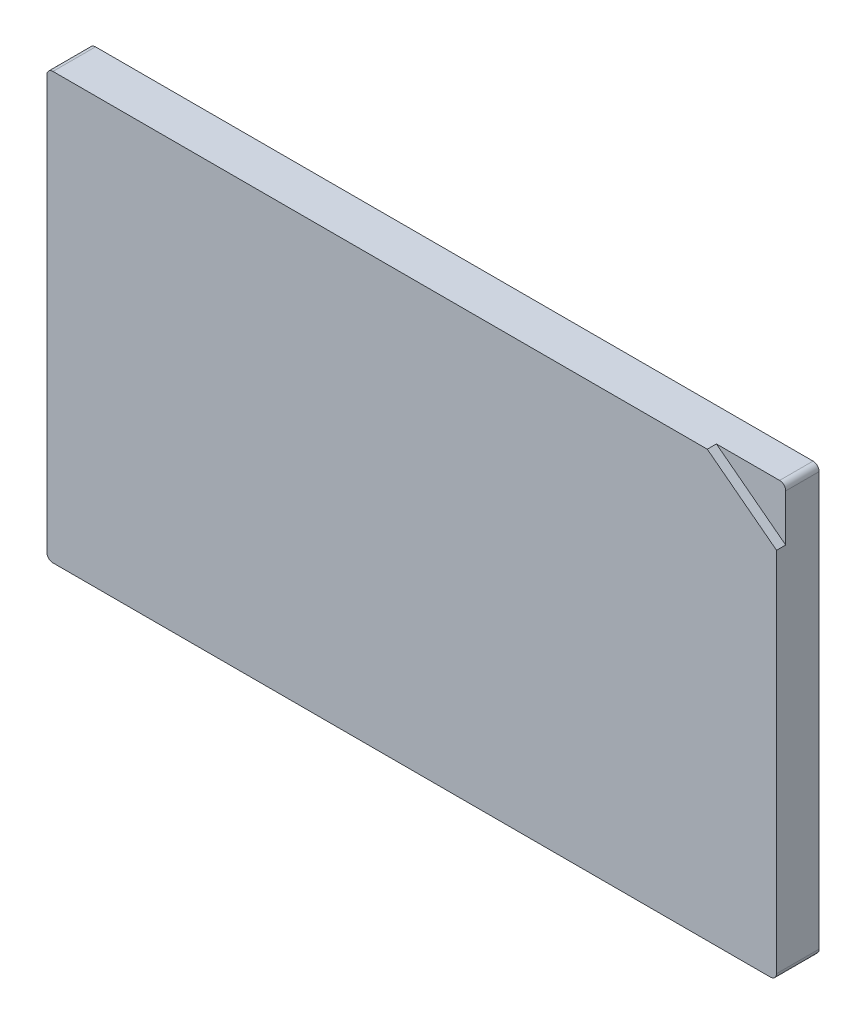
ISO-10303-21;
HEADER;
FILE_DESCRIPTION(('STEP AP214'),'2;1');
FILE_NAME('part.step','',(''),(''),'','','');
FILE_SCHEMA(('AUTOMOTIVE_DESIGN { 1 0 10303 214 1 1 1 1 }'));
ENDSEC;
DATA;
#1=APPLICATION_CONTEXT('core data for automotive mechanical design processes');
#2=APPLICATION_PROTOCOL_DEFINITION('international standard','automotive_design',2000,#1);
#3=PRODUCT_CONTEXT('',#1,'mechanical');
#4=PRODUCT('Part','Part','',(#3));
#5=PRODUCT_RELATED_PRODUCT_CATEGORY('part','',(#4));
#6=PRODUCT_DEFINITION_FORMATION('','',#4);
#7=PRODUCT_DEFINITION_CONTEXT('part definition',#1,'design');
#8=PRODUCT_DEFINITION('design','',#6,#7);
#9=PRODUCT_DEFINITION_SHAPE('','',#8);
#10=(LENGTH_UNIT() NAMED_UNIT(*) SI_UNIT(.MILLI.,.METRE.));
#11=(NAMED_UNIT(*) PLANE_ANGLE_UNIT() SI_UNIT($,.RADIAN.));
#12=(NAMED_UNIT(*) SI_UNIT($,.STERADIAN.) SOLID_ANGLE_UNIT());
#13=UNCERTAINTY_MEASURE_WITH_UNIT(LENGTH_MEASURE(1.E-05),#10,'distance_accuracy_value','');
#14=(GEOMETRIC_REPRESENTATION_CONTEXT(3) GLOBAL_UNCERTAINTY_ASSIGNED_CONTEXT((#13)) GLOBAL_UNIT_ASSIGNED_CONTEXT((#10,
#11,#12)) REPRESENTATION_CONTEXT('',''));
#15=CARTESIAN_POINT('',(0.,0.,0.));
#16=DIRECTION('',(0.,0.,1.));
#17=DIRECTION('',(1.,0.,0.));
#18=AXIS2_PLACEMENT_3D('',#15,#16,#17);
#19=CARTESIAN_POINT('',(-7.51456310679612,4.9126213592233,0.7));
#20=DIRECTION('',(1.,0.,0.));
#21=DIRECTION('',(0.,0.,-1.));
#22=AXIS2_PLACEMENT_3D('',#19,#20,#21);
#23=PLANE('',#22);
#24=DIRECTION('',(0.,-1.,0.));
#25=VECTOR('',#24,1.);
#26=CARTESIAN_POINT('',(-7.51456310679612,4.9126213592233,0.7));
#27=LINE('',#26,#25);
#28=CARTESIAN_POINT('',(-7.51456310679612,4.8126213592233,0.7));
#29=VERTEX_POINT('',#28);
#30=CARTESIAN_POINT('',(-7.51456310679612,-1.9873786407767,0.7));
#31=VERTEX_POINT('',#30);
#32=EDGE_CURVE('E144',#29,#31,#27,.T.);
#33=ORIENTED_EDGE('',*,*,#32,.F.);
#34=DIRECTION('',(0.,0.,-1.));
#35=VECTOR('',#34,1.);
#36=CARTESIAN_POINT('',(-7.51456310679612,4.8126213592233,0.7));
#37=LINE('',#36,#35);
#38=CARTESIAN_POINT('',(-7.51456310679612,4.8126213592233,0.));
#39=VERTEX_POINT('',#38);
#40=EDGE_CURVE('E163',#29,#39,#37,.T.);
#41=ORIENTED_EDGE('',*,*,#40,.T.);
#42=DIRECTION('',(0.,-1.,0.));
#43=VECTOR('',#42,1.);
#44=CARTESIAN_POINT('',(-7.51456310679612,4.9126213592233,0.));
#45=LINE('',#44,#43);
#46=CARTESIAN_POINT('',(-7.51456310679612,-1.9873786407767,0.));
#47=VERTEX_POINT('',#46);
#48=EDGE_CURVE('E139',#39,#47,#45,.T.);
#49=ORIENTED_EDGE('',*,*,#48,.T.);
#50=DIRECTION('',(0.,0.,-1.));
#51=VECTOR('',#50,1.);
#52=CARTESIAN_POINT('',(-7.51456310679612,-1.9873786407767,0.7));
#53=LINE('',#52,#51);
#54=EDGE_CURVE('E153',#47,#31,#53,.F.);
#55=ORIENTED_EDGE('',*,*,#54,.T.);
#56=EDGE_LOOP('',(#33,#41,#49,#55));
#57=FACE_BOUND('',#56,.T.);
#58=ADVANCED_FACE('F34',(#57),#23,.F.);
#59=CARTESIAN_POINT('',(-7.51456310679612,-2.0873786407767,0.7));
#60=DIRECTION('',(0.,1.,0.));
#61=DIRECTION('',(0.,0.,1.));
#62=AXIS2_PLACEMENT_3D('',#59,#60,#61);
#63=PLANE('',#62);
#64=DIRECTION('',(1.,0.,0.));
#65=VECTOR('',#64,1.);
#66=CARTESIAN_POINT('',(-7.51456310679612,-2.0873786407767,0.7));
#67=LINE('',#66,#65);
#68=CARTESIAN_POINT('',(-7.41456310679612,-2.0873786407767,0.7));
#69=VERTEX_POINT('',#68);
#70=CARTESIAN_POINT('',(4.38543689320388,-2.0873786407767,0.7));
#71=VERTEX_POINT('',#70);
#72=EDGE_CURVE('E147',#69,#71,#67,.T.);
#73=ORIENTED_EDGE('',*,*,#72,.F.);
#74=DIRECTION('',(0.,0.,-1.));
#75=VECTOR('',#74,1.);
#76=CARTESIAN_POINT('',(-7.41456310679612,-2.0873786407767,0.7));
#77=LINE('',#76,#75);
#78=CARTESIAN_POINT('',(-7.41456310679612,-2.0873786407767,0.));
#79=VERTEX_POINT('',#78);
#80=EDGE_CURVE('E185',#69,#79,#77,.T.);
#81=ORIENTED_EDGE('',*,*,#80,.T.);
#82=DIRECTION('',(1.,0.,0.));
#83=VECTOR('',#82,1.);
#84=CARTESIAN_POINT('',(-7.51456310679612,-2.0873786407767,0.));
#85=LINE('',#84,#83);
#86=CARTESIAN_POINT('',(4.38543689320388,-2.0873786407767,0.));
#87=VERTEX_POINT('',#86);
#88=EDGE_CURVE('E156',#79,#87,#85,.T.);
#89=ORIENTED_EDGE('',*,*,#88,.T.);
#90=DIRECTION('',(0.,0.,-1.));
#91=VECTOR('',#90,1.);
#92=CARTESIAN_POINT('',(4.38543689320388,-2.0873786407767,0.7));
#93=LINE('',#92,#91);
#94=EDGE_CURVE('E183',#87,#71,#93,.F.);
#95=ORIENTED_EDGE('',*,*,#94,.T.);
#96=EDGE_LOOP('',(#73,#81,#89,#95));
#97=FACE_BOUND('',#96,.T.);
#98=ADVANCED_FACE('F214',(#97),#63,.F.);
#99=CARTESIAN_POINT('',(4.48543689320388,4.9126213592233,0.7));
#100=DIRECTION('',(-1.,0.,0.));
#101=DIRECTION('',(0.,-1.,0.));
#102=AXIS2_PLACEMENT_3D('',#99,#100,#101);
#103=PLANE('',#102);
#104=DIRECTION('',(0.,1.,0.));
#105=VECTOR('',#104,1.);
#106=CARTESIAN_POINT('',(4.48543689320388,4.9126213592233,0.7));
#107=LINE('',#106,#105);
#108=CARTESIAN_POINT('',(4.48543689320388,-1.9873786407767,0.7));
#109=VERTEX_POINT('',#108);
#110=CARTESIAN_POINT('',(4.48543689320388,4.0423598927584,0.7));
#111=VERTEX_POINT('',#110);
#112=EDGE_CURVE('E150',#109,#111,#107,.T.);
#113=ORIENTED_EDGE('',*,*,#112,.F.);
#114=DIRECTION('',(0.,0.,-1.));
#115=VECTOR('',#114,1.);
#116=CARTESIAN_POINT('',(4.48543689320388,-1.9873786407767,0.7));
#117=LINE('',#116,#115);
#118=CARTESIAN_POINT('',(4.48543689320388,-1.9873786407767,0.));
#119=VERTEX_POINT('',#118);
#120=EDGE_CURVE('E42',#109,#119,#117,.T.);
#121=ORIENTED_EDGE('',*,*,#120,.T.);
#122=DIRECTION('',(0.,1.,0.));
#123=VECTOR('',#122,1.);
#124=CARTESIAN_POINT('',(4.48543689320388,4.9126213592233,0.));
#125=LINE('',#124,#123);
#126=CARTESIAN_POINT('',(4.48543689320388,4.8126213592233,0.));
#127=VERTEX_POINT('',#126);
#128=EDGE_CURVE('E159',#119,#127,#125,.T.);
#129=ORIENTED_EDGE('',*,*,#128,.T.);
#130=DIRECTION('',(0.,0.,-1.));
#131=VECTOR('',#130,1.);
#132=CARTESIAN_POINT('',(4.48543689320388,4.8126213592233,0.7));
#133=LINE('',#132,#131);
#134=CARTESIAN_POINT('',(4.48543689320388,4.8126213592233,0.55));
#135=VERTEX_POINT('',#134);
#136=EDGE_CURVE('E49',#127,#135,#133,.F.);
#137=ORIENTED_EDGE('',*,*,#136,.T.);
#138=DIRECTION('',(0.,1.,0.));
#139=VECTOR('',#138,1.);
#140=CARTESIAN_POINT('',(4.48543689320388,4.0423598927584,0.55));
#141=LINE('',#140,#139);
#142=CARTESIAN_POINT('',(4.48543689320388,4.0423598927584,0.55));
#143=VERTEX_POINT('',#142);
#144=EDGE_CURVE('E131',#143,#135,#141,.T.);
#145=ORIENTED_EDGE('',*,*,#144,.F.);
#146=DIRECTION('',(0.,0.,1.));
#147=VECTOR('',#146,1.);
#148=CARTESIAN_POINT('',(4.48543689320388,4.0423598927584,0.55));
#149=LINE('',#148,#147);
#150=EDGE_CURVE('E130',#143,#111,#149,.T.);
#151=ORIENTED_EDGE('',*,*,#150,.T.);
#152=EDGE_LOOP('',(#113,#121,#129,#137,#145,#151));
#153=FACE_BOUND('',#152,.T.);
#154=ADVANCED_FACE('F191',(#153),#103,.F.);
#155=CARTESIAN_POINT('',(-7.51456310679612,4.9126213592233,0.7));
#156=DIRECTION('',(0.,-1.,0.));
#157=DIRECTION('',(0.,0.,-1.));
#158=AXIS2_PLACEMENT_3D('',#155,#156,#157);
#159=PLANE('',#158);
#160=DIRECTION('',(-1.,0.,0.));
#161=VECTOR('',#160,1.);
#162=CARTESIAN_POINT('',(-7.51456310679612,4.9126213592233,0.));
#163=LINE('',#162,#161);
#164=CARTESIAN_POINT('',(4.38543689320388,4.9126213592233,0.));
#165=VERTEX_POINT('',#164);
#166=CARTESIAN_POINT('',(-7.41456310679612,4.9126213592233,0.));
#167=VERTEX_POINT('',#166);
#168=EDGE_CURVE('E148',#165,#167,#163,.T.);
#169=ORIENTED_EDGE('',*,*,#168,.T.);
#170=DIRECTION('',(0.,0.,-1.));
#171=VECTOR('',#170,1.);
#172=CARTESIAN_POINT('',(-7.41456310679612,4.9126213592233,0.7));
#173=LINE('',#172,#171);
#174=CARTESIAN_POINT('',(-7.41456310679612,4.9126213592233,0.7));
#175=VERTEX_POINT('',#174);
#176=EDGE_CURVE('E176',#167,#175,#173,.F.);
#177=ORIENTED_EDGE('',*,*,#176,.T.);
#178=DIRECTION('',(-1.,0.,0.));
#179=VECTOR('',#178,1.);
#180=CARTESIAN_POINT('',(-7.51456310679612,4.9126213592233,0.7));
#181=LINE('',#180,#179);
#182=CARTESIAN_POINT('',(3.34607568700057,4.9126213592233,0.7));
#183=VERTEX_POINT('',#182);
#184=EDGE_CURVE('E137',#183,#175,#181,.T.);
#185=ORIENTED_EDGE('',*,*,#184,.F.);
#186=DIRECTION('',(0.,0.,1.));
#187=VECTOR('',#186,1.);
#188=CARTESIAN_POINT('',(3.34607568700057,4.9126213592233,0.55));
#189=LINE('',#188,#187);
#190=CARTESIAN_POINT('',(3.34607568700057,4.9126213592233,0.55));
#191=VERTEX_POINT('',#190);
#192=EDGE_CURVE('E127',#191,#183,#189,.T.);
#193=ORIENTED_EDGE('',*,*,#192,.F.);
#194=DIRECTION('',(-1.,0.,0.));
#195=VECTOR('',#194,1.);
#196=CARTESIAN_POINT('',(4.48543689320388,4.9126213592233,0.55));
#197=LINE('',#196,#195);
#198=CARTESIAN_POINT('',(4.38543689320388,4.9126213592233,0.55));
#199=VERTEX_POINT('',#198);
#200=EDGE_CURVE('E113',#199,#191,#197,.T.);
#201=ORIENTED_EDGE('',*,*,#200,.F.);
#202=DIRECTION('',(0.,0.,-1.));
#203=VECTOR('',#202,1.);
#204=CARTESIAN_POINT('',(4.38543689320388,4.9126213592233,0.7));
#205=LINE('',#204,#203);
#206=EDGE_CURVE('E174',#199,#165,#205,.T.);
#207=ORIENTED_EDGE('',*,*,#206,.T.);
#208=EDGE_LOOP('',(#169,#177,#185,#193,#201,#207));
#209=FACE_BOUND('',#208,.T.);
#210=ADVANCED_FACE('F135',(#209),#159,.F.);
#211=CARTESIAN_POINT('',(0.,0.,0.7));
#212=DIRECTION('',(0.,0.,1.));
#213=DIRECTION('',(1.,0.,0.));
#214=AXIS2_PLACEMENT_3D('',#211,#212,#213);
#215=PLANE('',#214);
#216=ORIENTED_EDGE('',*,*,#184,.T.);
#217=CARTESIAN_POINT('',(-7.41456310679612,4.8126213592233,0.7));
#218=DIRECTION('',(0.,0.,1.));
#219=DIRECTION('',(1.,0.,0.));
#220=AXIS2_PLACEMENT_3D('',#217,#218,#219);
#221=CIRCLE('',#220,0.1);
#222=EDGE_CURVE('E181',#175,#29,#221,.T.);
#223=ORIENTED_EDGE('',*,*,#222,.T.);
#224=ORIENTED_EDGE('',*,*,#32,.T.);
#225=CARTESIAN_POINT('',(-7.41456310679612,-1.9873786407767,0.7));
#226=DIRECTION('',(0.,0.,1.));
#227=DIRECTION('',(1.,0.,0.));
#228=AXIS2_PLACEMENT_3D('',#225,#226,#227);
#229=CIRCLE('',#228,0.1);
#230=EDGE_CURVE('E179',#31,#69,#229,.T.);
#231=ORIENTED_EDGE('',*,*,#230,.T.);
#232=ORIENTED_EDGE('',*,*,#72,.T.);
#233=CARTESIAN_POINT('',(4.38543689320388,-1.9873786407767,0.7));
#234=DIRECTION('',(0.,0.,1.));
#235=DIRECTION('',(1.,0.,0.));
#236=AXIS2_PLACEMENT_3D('',#233,#234,#235);
#237=CIRCLE('',#236,0.1);
#238=EDGE_CURVE('E57',#71,#109,#237,.T.);
#239=ORIENTED_EDGE('',*,*,#238,.T.);
#240=ORIENTED_EDGE('',*,*,#112,.T.);
#241=DIRECTION('',(0.794699236155224,-0.607003397069821,0.));
#242=VECTOR('',#241,1.);
#243=CARTESIAN_POINT('',(3.34607568700057,4.9126213592233,0.7));
#244=LINE('',#243,#242);
#245=EDGE_CURVE('E122',#183,#111,#244,.T.);
#246=ORIENTED_EDGE('',*,*,#245,.F.);
#247=EDGE_LOOP('',(#216,#223,#224,#231,#232,#239,#240,#246));
#248=FACE_BOUND('',#247,.T.);
#249=ADVANCED_FACE('F205',(#248),#215,.T.);
#250=CARTESIAN_POINT('',(0.,0.,0.));
#251=DIRECTION('',(0.,0.,1.));
#252=DIRECTION('',(1.,0.,0.));
#253=AXIS2_PLACEMENT_3D('',#250,#251,#252);
#254=PLANE('',#253);
#255=ORIENTED_EDGE('',*,*,#48,.F.);
#256=CARTESIAN_POINT('',(-7.41456310679612,4.8126213592233,0.));
#257=DIRECTION('',(0.,0.,1.));
#258=DIRECTION('',(1.,0.,0.));
#259=AXIS2_PLACEMENT_3D('',#256,#257,#258);
#260=CIRCLE('',#259,0.1);
#261=EDGE_CURVE('E172',#39,#167,#260,.F.);
#262=ORIENTED_EDGE('',*,*,#261,.T.);
#263=ORIENTED_EDGE('',*,*,#168,.F.);
#264=CARTESIAN_POINT('',(4.38543689320388,4.8126213592233,0.));
#265=DIRECTION('',(0.,0.,1.));
#266=DIRECTION('',(1.,0.,0.));
#267=AXIS2_PLACEMENT_3D('',#264,#265,#266);
#268=CIRCLE('',#267,0.1);
#269=EDGE_CURVE('E166',#165,#127,#268,.F.);
#270=ORIENTED_EDGE('',*,*,#269,.T.);
#271=ORIENTED_EDGE('',*,*,#128,.F.);
#272=CARTESIAN_POINT('',(4.38543689320388,-1.9873786407767,0.));
#273=DIRECTION('',(0.,0.,1.));
#274=DIRECTION('',(1.,0.,0.));
#275=AXIS2_PLACEMENT_3D('',#272,#273,#274);
#276=CIRCLE('',#275,0.1);
#277=EDGE_CURVE('E168',#119,#87,#276,.F.);
#278=ORIENTED_EDGE('',*,*,#277,.T.);
#279=ORIENTED_EDGE('',*,*,#88,.F.);
#280=CARTESIAN_POINT('',(-7.41456310679612,-1.9873786407767,0.));
#281=DIRECTION('',(0.,0.,1.));
#282=DIRECTION('',(1.,0.,0.));
#283=AXIS2_PLACEMENT_3D('',#280,#281,#282);
#284=CIRCLE('',#283,0.1);
#285=EDGE_CURVE('E170',#79,#47,#284,.F.);
#286=ORIENTED_EDGE('',*,*,#285,.T.);
#287=EDGE_LOOP('',(#255,#262,#263,#270,#271,#278,#279,#286));
#288=FACE_BOUND('',#287,.T.);
#289=ADVANCED_FACE('F195',(#288),#254,.F.);
#290=CARTESIAN_POINT('',(3.34607568700057,4.9126213592233,0.55));
#291=DIRECTION('',(-0.607003397069821,-0.794699236155224,0.));
#292=DIRECTION('',(0.794699236155224,-0.607003397069821,0.));
#293=AXIS2_PLACEMENT_3D('',#290,#291,#292);
#294=PLANE('',#293);
#295=ORIENTED_EDGE('',*,*,#245,.T.);
#296=ORIENTED_EDGE('',*,*,#150,.F.);
#297=DIRECTION('',(0.794699236155224,-0.607003397069821,0.));
#298=VECTOR('',#297,1.);
#299=CARTESIAN_POINT('',(3.34607568700057,4.9126213592233,0.55));
#300=LINE('',#299,#298);
#301=EDGE_CURVE('E116',#191,#143,#300,.T.);
#302=ORIENTED_EDGE('',*,*,#301,.F.);
#303=ORIENTED_EDGE('',*,*,#192,.T.);
#304=EDGE_LOOP('',(#295,#296,#302,#303));
#305=FACE_BOUND('',#304,.T.);
#306=ADVANCED_FACE('F126',(#305),#294,.F.);
#307=CARTESIAN_POINT('',(0.,0.,0.55));
#308=DIRECTION('',(0.,0.,-1.));
#309=DIRECTION('',(-1.,0.,0.));
#310=AXIS2_PLACEMENT_3D('',#307,#308,#309);
#311=PLANE('',#310);
#312=ORIENTED_EDGE('',*,*,#144,.T.);
#313=CARTESIAN_POINT('',(4.38543689320388,4.8126213592233,0.55));
#314=DIRECTION('',(0.,0.,-1.));
#315=DIRECTION('',(-1.,0.,0.));
#316=AXIS2_PLACEMENT_3D('',#313,#314,#315);
#317=CIRCLE('',#316,0.1);
#318=EDGE_CURVE('E11',#135,#199,#317,.F.);
#319=ORIENTED_EDGE('',*,*,#318,.T.);
#320=ORIENTED_EDGE('',*,*,#200,.T.);
#321=ORIENTED_EDGE('',*,*,#301,.T.);
#322=EDGE_LOOP('',(#312,#319,#320,#321));
#323=FACE_BOUND('',#322,.T.);
#324=ADVANCED_FACE('F115',(#323),#311,.F.);
#325=CARTESIAN_POINT('',(-7.41456310679612,4.8126213592233,0.7));
#326=DIRECTION('',(0.,0.,-1.));
#327=DIRECTION('',(-1.,0.,0.));
#328=AXIS2_PLACEMENT_3D('',#325,#326,#327);
#329=CYLINDRICAL_SURFACE('',#328,0.1);
#330=ORIENTED_EDGE('',*,*,#222,.F.);
#331=ORIENTED_EDGE('',*,*,#176,.F.);
#332=ORIENTED_EDGE('',*,*,#261,.F.);
#333=ORIENTED_EDGE('',*,*,#40,.F.);
#334=EDGE_LOOP('',(#330,#331,#332,#333));
#335=FACE_BOUND('',#334,.T.);
#336=ADVANCED_FACE('F202',(#335),#329,.T.);
#337=CARTESIAN_POINT('',(-7.41456310679612,-1.9873786407767,0.7));
#338=DIRECTION('',(0.,0.,-1.));
#339=DIRECTION('',(-1.,0.,0.));
#340=AXIS2_PLACEMENT_3D('',#337,#338,#339);
#341=CYLINDRICAL_SURFACE('',#340,0.1);
#342=ORIENTED_EDGE('',*,*,#230,.F.);
#343=ORIENTED_EDGE('',*,*,#54,.F.);
#344=ORIENTED_EDGE('',*,*,#285,.F.);
#345=ORIENTED_EDGE('',*,*,#80,.F.);
#346=EDGE_LOOP('',(#342,#343,#344,#345));
#347=FACE_BOUND('',#346,.T.);
#348=ADVANCED_FACE('F210',(#347),#341,.T.);
#349=CARTESIAN_POINT('',(4.38543689320388,-1.9873786407767,0.7));
#350=DIRECTION('',(0.,0.,-1.));
#351=DIRECTION('',(-1.,0.,0.));
#352=AXIS2_PLACEMENT_3D('',#349,#350,#351);
#353=CYLINDRICAL_SURFACE('',#352,0.1);
#354=ORIENTED_EDGE('',*,*,#238,.F.);
#355=ORIENTED_EDGE('',*,*,#94,.F.);
#356=ORIENTED_EDGE('',*,*,#277,.F.);
#357=ORIENTED_EDGE('',*,*,#120,.F.);
#358=EDGE_LOOP('',(#354,#355,#356,#357));
#359=FACE_BOUND('',#358,.T.);
#360=ADVANCED_FACE('F216',(#359),#353,.T.);
#361=CARTESIAN_POINT('',(4.38543689320388,4.8126213592233,0.7));
#362=DIRECTION('',(0.,0.,-1.));
#363=DIRECTION('',(-1.,0.,0.));
#364=AXIS2_PLACEMENT_3D('',#361,#362,#363);
#365=CYLINDRICAL_SURFACE('',#364,0.1);
#366=ORIENTED_EDGE('',*,*,#318,.F.);
#367=ORIENTED_EDGE('',*,*,#136,.F.);
#368=ORIENTED_EDGE('',*,*,#269,.F.);
#369=ORIENTED_EDGE('',*,*,#206,.F.);
#370=EDGE_LOOP('',(#366,#367,#368,#369));
#371=FACE_BOUND('',#370,.T.);
#372=ADVANCED_FACE('F36',(#371),#365,.T.);
#373=CLOSED_SHELL('',(#58,#98,#154,#210,#249,#289,#306,#324,#336,#348,#360,#372));
#374=MANIFOLD_SOLID_BREP('B2',#373);
#375=ADVANCED_BREP_SHAPE_REPRESENTATION('',(#18,#374),#14);
#376=SHAPE_DEFINITION_REPRESENTATION(#9,#375);
ENDSEC;
END-ISO-10303-21;
